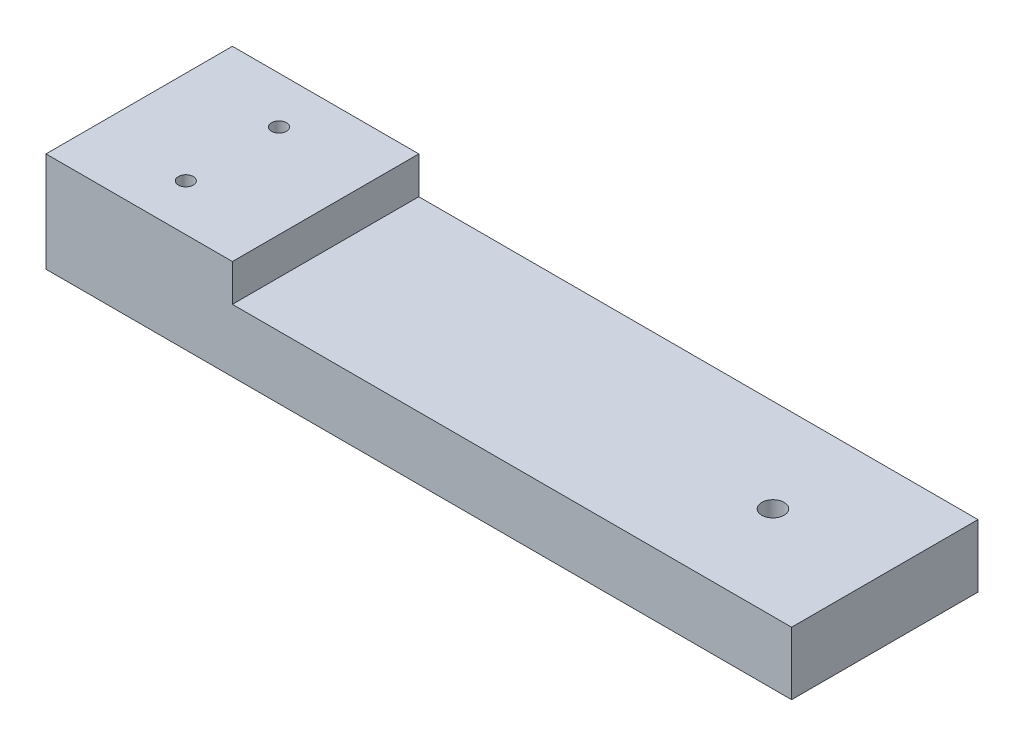
ISO-10303-21;
HEADER;
FILE_DESCRIPTION(('STEP AP214'),'2;1');
FILE_NAME('part.step','',(''),(''),'','','');
FILE_SCHEMA(('AUTOMOTIVE_DESIGN { 1 0 10303 214 1 1 1 1 }'));
ENDSEC;
DATA;
#1=APPLICATION_CONTEXT('core data for automotive mechanical design processes');
#2=APPLICATION_PROTOCOL_DEFINITION('international standard','automotive_design',2000,#1);
#3=PRODUCT_CONTEXT('',#1,'mechanical');
#4=PRODUCT('Part','Part','',(#3));
#5=PRODUCT_RELATED_PRODUCT_CATEGORY('part','',(#4));
#6=PRODUCT_DEFINITION_FORMATION('','',#4);
#7=PRODUCT_DEFINITION_CONTEXT('part definition',#1,'design');
#8=PRODUCT_DEFINITION('design','',#6,#7);
#9=PRODUCT_DEFINITION_SHAPE('','',#8);
#10=(LENGTH_UNIT() NAMED_UNIT(*) SI_UNIT(.MILLI.,.METRE.));
#11=(NAMED_UNIT(*) PLANE_ANGLE_UNIT() SI_UNIT($,.RADIAN.));
#12=(NAMED_UNIT(*) SI_UNIT($,.STERADIAN.) SOLID_ANGLE_UNIT());
#13=UNCERTAINTY_MEASURE_WITH_UNIT(LENGTH_MEASURE(1.E-05),#10,'distance_accuracy_value','');
#14=(GEOMETRIC_REPRESENTATION_CONTEXT(3) GLOBAL_UNCERTAINTY_ASSIGNED_CONTEXT((#13)) GLOBAL_UNIT_ASSIGNED_CONTEXT((#10,
#11,#12)) REPRESENTATION_CONTEXT('',''));
#15=CARTESIAN_POINT('',(0.,0.,0.));
#16=DIRECTION('',(0.,0.,1.));
#17=DIRECTION('',(1.,0.,0.));
#18=AXIS2_PLACEMENT_3D('',#15,#16,#17);
#19=CARTESIAN_POINT('',(0.,26.8,0.));
#20=DIRECTION('',(0.,0.,1.));
#21=DIRECTION('',(-1.,0.,0.));
#22=AXIS2_PLACEMENT_3D('',#19,#20,#21);
#23=PLANE('',#22);
#24=DIRECTION('',(1.,0.,0.));
#25=VECTOR('',#24,1.);
#26=CARTESIAN_POINT('',(0.,0.,0.));
#27=LINE('',#26,#25);
#28=CARTESIAN_POINT('',(0.,0.,0.));
#29=VERTEX_POINT('',#28);
#30=CARTESIAN_POINT('',(200.,0.,0.));
#31=VERTEX_POINT('',#30);
#32=EDGE_CURVE('E119',#29,#31,#27,.T.);
#33=ORIENTED_EDGE('',*,*,#32,.F.);
#34=DIRECTION('',(0.,-1.,0.));
#35=VECTOR('',#34,1.);
#36=CARTESIAN_POINT('',(0.,26.8,0.));
#37=LINE('',#36,#35);
#38=CARTESIAN_POINT('',(0.,26.8,0.));
#39=VERTEX_POINT('',#38);
#40=EDGE_CURVE('E132',#39,#29,#37,.T.);
#41=ORIENTED_EDGE('',*,*,#40,.F.);
#42=DIRECTION('',(1.,0.,0.));
#43=VECTOR('',#42,1.);
#44=CARTESIAN_POINT('',(0.,26.8,0.));
#45=LINE('',#44,#43);
#46=CARTESIAN_POINT('',(50.,26.8,0.));
#47=VERTEX_POINT('',#46);
#48=EDGE_CURVE('E126',#39,#47,#45,.T.);
#49=ORIENTED_EDGE('',*,*,#48,.T.);
#50=DIRECTION('',(0.,-1.,0.));
#51=VECTOR('',#50,1.);
#52=CARTESIAN_POINT('',(50.,26.8,0.));
#53=LINE('',#52,#51);
#54=CARTESIAN_POINT('',(50.,16.85,0.));
#55=VERTEX_POINT('',#54);
#56=EDGE_CURVE('E11',#47,#55,#53,.T.);
#57=ORIENTED_EDGE('',*,*,#56,.T.);
#58=DIRECTION('',(1.,0.,0.));
#59=VECTOR('',#58,1.);
#60=CARTESIAN_POINT('',(0.,16.85,0.));
#61=LINE('',#60,#59);
#62=CARTESIAN_POINT('',(200.,16.85,0.));
#63=VERTEX_POINT('',#62);
#64=EDGE_CURVE('E122',#55,#63,#61,.T.);
#65=ORIENTED_EDGE('',*,*,#64,.T.);
#66=DIRECTION('',(0.,-1.,0.));
#67=VECTOR('',#66,1.);
#68=CARTESIAN_POINT('',(200.,16.85,0.));
#69=LINE('',#68,#67);
#70=EDGE_CURVE('E106',#63,#31,#69,.T.);
#71=ORIENTED_EDGE('',*,*,#70,.T.);
#72=EDGE_LOOP('',(#33,#41,#49,#57,#65,#71));
#73=FACE_BOUND('',#72,.T.);
#74=ADVANCED_FACE('F37',(#73),#23,.F.);
#75=CARTESIAN_POINT('',(50.,26.8,0.));
#76=DIRECTION('',(-1.,0.,0.));
#77=DIRECTION('',(0.,0.,-1.));
#78=AXIS2_PLACEMENT_3D('',#75,#76,#77);
#79=PLANE('',#78);
#80=ORIENTED_EDGE('',*,*,#56,.F.);
#81=DIRECTION('',(0.,0.,1.));
#82=VECTOR('',#81,1.);
#83=CARTESIAN_POINT('',(50.,26.8,0.));
#84=LINE('',#83,#82);
#85=CARTESIAN_POINT('',(50.,26.8,50.));
#86=VERTEX_POINT('',#85);
#87=EDGE_CURVE('E82',#47,#86,#84,.T.);
#88=ORIENTED_EDGE('',*,*,#87,.T.);
#89=DIRECTION('',(0.,-1.,0.));
#90=VECTOR('',#89,1.);
#91=CARTESIAN_POINT('',(50.,26.8,50.));
#92=LINE('',#91,#90);
#93=CARTESIAN_POINT('',(50.,16.85,50.));
#94=VERTEX_POINT('',#93);
#95=EDGE_CURVE('E45',#86,#94,#92,.T.);
#96=ORIENTED_EDGE('',*,*,#95,.T.);
#97=DIRECTION('',(0.,0.,1.));
#98=VECTOR('',#97,1.);
#99=CARTESIAN_POINT('',(50.,16.85,0.));
#100=LINE('',#99,#98);
#101=EDGE_CURVE('E113',#55,#94,#100,.T.);
#102=ORIENTED_EDGE('',*,*,#101,.F.);
#103=EDGE_LOOP('',(#80,#88,#96,#102));
#104=FACE_BOUND('',#103,.T.);
#105=ADVANCED_FACE('F140',(#104),#79,.F.);
#106=CARTESIAN_POINT('',(0.,26.8,50.));
#107=DIRECTION('',(0.,0.,1.));
#108=DIRECTION('',(-1.,0.,0.));
#109=AXIS2_PLACEMENT_3D('',#106,#107,#108);
#110=PLANE('',#109);
#111=DIRECTION('',(1.,0.,0.));
#112=VECTOR('',#111,1.);
#113=CARTESIAN_POINT('',(0.,0.,50.));
#114=LINE('',#113,#112);
#115=CARTESIAN_POINT('',(0.,0.,50.));
#116=VERTEX_POINT('',#115);
#117=CARTESIAN_POINT('',(200.,0.,50.));
#118=VERTEX_POINT('',#117);
#119=EDGE_CURVE('E118',#116,#118,#114,.T.);
#120=ORIENTED_EDGE('',*,*,#119,.T.);
#121=DIRECTION('',(0.,-1.,0.));
#122=VECTOR('',#121,1.);
#123=CARTESIAN_POINT('',(200.,16.85,50.));
#124=LINE('',#123,#122);
#125=CARTESIAN_POINT('',(200.,16.85,50.));
#126=VERTEX_POINT('',#125);
#127=EDGE_CURVE('E103',#126,#118,#124,.T.);
#128=ORIENTED_EDGE('',*,*,#127,.F.);
#129=DIRECTION('',(1.,0.,0.));
#130=VECTOR('',#129,1.);
#131=CARTESIAN_POINT('',(0.,16.85,50.));
#132=LINE('',#131,#130);
#133=EDGE_CURVE('E52',#94,#126,#132,.T.);
#134=ORIENTED_EDGE('',*,*,#133,.F.);
#135=ORIENTED_EDGE('',*,*,#95,.F.);
#136=DIRECTION('',(1.,0.,0.));
#137=VECTOR('',#136,1.);
#138=CARTESIAN_POINT('',(0.,26.8,50.));
#139=LINE('',#138,#137);
#140=CARTESIAN_POINT('',(0.,26.8,50.));
#141=VERTEX_POINT('',#140);
#142=EDGE_CURVE('E130',#141,#86,#139,.T.);
#143=ORIENTED_EDGE('',*,*,#142,.F.);
#144=DIRECTION('',(0.,-1.,0.));
#145=VECTOR('',#144,1.);
#146=CARTESIAN_POINT('',(0.,26.8,50.));
#147=LINE('',#146,#145);
#148=EDGE_CURVE('E137',#141,#116,#147,.T.);
#149=ORIENTED_EDGE('',*,*,#148,.T.);
#150=EDGE_LOOP('',(#120,#128,#134,#135,#143,#149));
#151=FACE_BOUND('',#150,.T.);
#152=ADVANCED_FACE('F116',(#151),#110,.T.);
#153=CARTESIAN_POINT('',(0.,26.8,0.));
#154=DIRECTION('',(-1.,0.,0.));
#155=DIRECTION('',(0.,0.,-1.));
#156=AXIS2_PLACEMENT_3D('',#153,#154,#155);
#157=PLANE('',#156);
#158=DIRECTION('',(0.,0.,1.));
#159=VECTOR('',#158,1.);
#160=CARTESIAN_POINT('',(0.,0.,0.));
#161=LINE('',#160,#159);
#162=EDGE_CURVE('E76',#29,#116,#161,.T.);
#163=ORIENTED_EDGE('',*,*,#162,.T.);
#164=ORIENTED_EDGE('',*,*,#148,.F.);
#165=DIRECTION('',(0.,0.,1.));
#166=VECTOR('',#165,1.);
#167=CARTESIAN_POINT('',(0.,26.8,0.));
#168=LINE('',#167,#166);
#169=EDGE_CURVE('E61',#39,#141,#168,.T.);
#170=ORIENTED_EDGE('',*,*,#169,.F.);
#171=ORIENTED_EDGE('',*,*,#40,.T.);
#172=EDGE_LOOP('',(#163,#164,#170,#171));
#173=FACE_BOUND('',#172,.T.);
#174=ADVANCED_FACE('F144',(#173),#157,.T.);
#175=CARTESIAN_POINT('',(0.,26.8,0.));
#176=DIRECTION('',(0.,1.,0.));
#177=DIRECTION('',(0.,0.,-1.));
#178=AXIS2_PLACEMENT_3D('',#175,#176,#177);
#179=PLANE('',#178);
#180=CARTESIAN_POINT('',(25.,26.8,12.5));
#181=DIRECTION('',(0.,1.,0.));
#182=DIRECTION('',(0.,0.,1.));
#183=AXIS2_PLACEMENT_3D('',#180,#181,#182);
#184=CIRCLE('',#183,2.);
#185=CARTESIAN_POINT('',(25.,26.8,14.5));
#186=VERTEX_POINT('',#185);
#187=EDGE_CURVE('E149',#186,#186,#184,.T.);
#188=ORIENTED_EDGE('',*,*,#187,.F.);
#189=EDGE_LOOP('',(#188));
#190=FACE_BOUND('',#189,.T.);
#191=CARTESIAN_POINT('',(25.,26.8,37.5));
#192=DIRECTION('',(0.,1.,0.));
#193=DIRECTION('',(0.,0.,1.));
#194=AXIS2_PLACEMENT_3D('',#191,#192,#193);
#195=CIRCLE('',#194,2.);
#196=CARTESIAN_POINT('',(25.,26.8,39.5));
#197=VERTEX_POINT('',#196);
#198=EDGE_CURVE('E156',#197,#197,#195,.T.);
#199=ORIENTED_EDGE('',*,*,#198,.F.);
#200=EDGE_LOOP('',(#199));
#201=FACE_BOUND('',#200,.T.);
#202=ORIENTED_EDGE('',*,*,#48,.F.);
#203=ORIENTED_EDGE('',*,*,#169,.T.);
#204=ORIENTED_EDGE('',*,*,#142,.T.);
#205=ORIENTED_EDGE('',*,*,#87,.F.);
#206=EDGE_LOOP('',(#202,#203,#204,#205));
#207=FACE_BOUND('',#206,.T.);
#208=ADVANCED_FACE('F142',(#190,#201,#207),#179,.T.);
#209=CARTESIAN_POINT('',(0.,0.,0.));
#210=DIRECTION('',(0.,1.,0.));
#211=DIRECTION('',(0.,0.,-1.));
#212=AXIS2_PLACEMENT_3D('',#209,#210,#211);
#213=PLANE('',#212);
#214=CARTESIAN_POINT('',(25.,0.,12.5));
#215=DIRECTION('',(0.,1.,0.));
#216=DIRECTION('',(0.,0.,1.));
#217=AXIS2_PLACEMENT_3D('',#214,#215,#216);
#218=CIRCLE('',#217,2.);
#219=CARTESIAN_POINT('',(25.,0.,14.5));
#220=VERTEX_POINT('',#219);
#221=EDGE_CURVE('E162',#220,#220,#218,.T.);
#222=ORIENTED_EDGE('',*,*,#221,.T.);
#223=EDGE_LOOP('',(#222));
#224=FACE_BOUND('',#223,.T.);
#225=CARTESIAN_POINT('',(25.,0.,37.5));
#226=DIRECTION('',(0.,1.,0.));
#227=DIRECTION('',(0.,0.,1.));
#228=AXIS2_PLACEMENT_3D('',#225,#226,#227);
#229=CIRCLE('',#228,2.);
#230=CARTESIAN_POINT('',(25.,0.,39.5));
#231=VERTEX_POINT('',#230);
#232=EDGE_CURVE('E159',#231,#231,#229,.T.);
#233=ORIENTED_EDGE('',*,*,#232,.T.);
#234=EDGE_LOOP('',(#233));
#235=FACE_BOUND('',#234,.T.);
#236=CARTESIAN_POINT('',(170.,0.,25.));
#237=DIRECTION('',(0.,1.,0.));
#238=DIRECTION('',(0.,0.,1.));
#239=AXIS2_PLACEMENT_3D('',#236,#237,#238);
#240=CIRCLE('',#239,2.99999999999999);
#241=CARTESIAN_POINT('',(170.,0.,28.));
#242=VERTEX_POINT('',#241);
#243=EDGE_CURVE('E153',#242,#242,#240,.T.);
#244=ORIENTED_EDGE('',*,*,#243,.T.);
#245=EDGE_LOOP('',(#244));
#246=FACE_BOUND('',#245,.T.);
#247=ORIENTED_EDGE('',*,*,#32,.T.);
#248=DIRECTION('',(0.,0.,-1.));
#249=VECTOR('',#248,1.);
#250=CARTESIAN_POINT('',(200.,0.,0.));
#251=LINE('',#250,#249);
#252=EDGE_CURVE('E110',#118,#31,#251,.T.);
#253=ORIENTED_EDGE('',*,*,#252,.F.);
#254=ORIENTED_EDGE('',*,*,#119,.F.);
#255=ORIENTED_EDGE('',*,*,#162,.F.);
#256=EDGE_LOOP('',(#247,#253,#254,#255));
#257=FACE_BOUND('',#256,.T.);
#258=ADVANCED_FACE('F147',(#224,#235,#246,#257),#213,.F.);
#259=CARTESIAN_POINT('',(200.,16.85,0.));
#260=DIRECTION('',(1.,0.,0.));
#261=DIRECTION('',(0.,0.,1.));
#262=AXIS2_PLACEMENT_3D('',#259,#260,#261);
#263=PLANE('',#262);
#264=ORIENTED_EDGE('',*,*,#252,.T.);
#265=ORIENTED_EDGE('',*,*,#70,.F.);
#266=DIRECTION('',(0.,0.,-1.));
#267=VECTOR('',#266,1.);
#268=CARTESIAN_POINT('',(200.,16.85,0.));
#269=LINE('',#268,#267);
#270=EDGE_CURVE('E101',#126,#63,#269,.T.);
#271=ORIENTED_EDGE('',*,*,#270,.F.);
#272=ORIENTED_EDGE('',*,*,#127,.T.);
#273=EDGE_LOOP('',(#264,#265,#271,#272));
#274=FACE_BOUND('',#273,.T.);
#275=ADVANCED_FACE('F102',(#274),#263,.T.);
#276=CARTESIAN_POINT('',(0.,16.85,0.));
#277=DIRECTION('',(0.,1.,0.));
#278=DIRECTION('',(0.,0.,-1.));
#279=AXIS2_PLACEMENT_3D('',#276,#277,#278);
#280=PLANE('',#279);
#281=CARTESIAN_POINT('',(170.,16.85,25.));
#282=DIRECTION('',(0.,-1.,0.));
#283=DIRECTION('',(0.,0.,-1.));
#284=AXIS2_PLACEMENT_3D('',#281,#282,#283);
#285=CIRCLE('',#284,2.99999999999999);
#286=CARTESIAN_POINT('',(170.,16.85,22.));
#287=VERTEX_POINT('',#286);
#288=EDGE_CURVE('E40',#287,#287,#285,.T.);
#289=ORIENTED_EDGE('',*,*,#288,.T.);
#290=EDGE_LOOP('',(#289));
#291=FACE_BOUND('',#290,.T.);
#292=ORIENTED_EDGE('',*,*,#270,.T.);
#293=ORIENTED_EDGE('',*,*,#64,.F.);
#294=ORIENTED_EDGE('',*,*,#101,.T.);
#295=ORIENTED_EDGE('',*,*,#133,.T.);
#296=EDGE_LOOP('',(#292,#293,#294,#295));
#297=FACE_BOUND('',#296,.T.);
#298=ADVANCED_FACE('F112',(#291,#297),#280,.T.);
#299=CARTESIAN_POINT('',(170.,26.8,25.));
#300=DIRECTION('',(0.,-1.,0.));
#301=DIRECTION('',(0.,0.,1.));
#302=AXIS2_PLACEMENT_3D('',#299,#300,#301);
#303=CYLINDRICAL_SURFACE('',#302,2.99999999999999);
#304=ORIENTED_EDGE('',*,*,#288,.F.);
#305=EDGE_LOOP('',(#304));
#306=FACE_BOUND('',#305,.T.);
#307=ORIENTED_EDGE('',*,*,#243,.F.);
#308=EDGE_LOOP('',(#307));
#309=FACE_BOUND('',#308,.T.);
#310=ADVANCED_FACE('F179',(#306,#309),#303,.F.);
#311=CARTESIAN_POINT('',(25.,26.8,37.5));
#312=DIRECTION('',(0.,-1.,0.));
#313=DIRECTION('',(0.,0.,1.));
#314=AXIS2_PLACEMENT_3D('',#311,#312,#313);
#315=CYLINDRICAL_SURFACE('',#314,2.);
#316=ORIENTED_EDGE('',*,*,#198,.T.);
#317=EDGE_LOOP('',(#316));
#318=FACE_BOUND('',#317,.T.);
#319=ORIENTED_EDGE('',*,*,#232,.F.);
#320=EDGE_LOOP('',(#319));
#321=FACE_BOUND('',#320,.T.);
#322=ADVANCED_FACE('F176',(#318,#321),#315,.F.);
#323=CARTESIAN_POINT('',(25.,26.8,12.5));
#324=DIRECTION('',(0.,-1.,0.));
#325=DIRECTION('',(0.,0.,1.));
#326=AXIS2_PLACEMENT_3D('',#323,#324,#325);
#327=CYLINDRICAL_SURFACE('',#326,2.);
#328=ORIENTED_EDGE('',*,*,#187,.T.);
#329=EDGE_LOOP('',(#328));
#330=FACE_BOUND('',#329,.T.);
#331=ORIENTED_EDGE('',*,*,#221,.F.);
#332=EDGE_LOOP('',(#331));
#333=FACE_BOUND('',#332,.T.);
#334=ADVANCED_FACE('F168',(#330,#333),#327,.F.);
#335=CLOSED_SHELL('',(#74,#105,#152,#174,#208,#258,#275,#298,#310,#322,#334));
#336=MANIFOLD_SOLID_BREP('B2',#335);
#337=ADVANCED_BREP_SHAPE_REPRESENTATION('',(#18,#336),#14);
#338=SHAPE_DEFINITION_REPRESENTATION(#9,#337);
ENDSEC;
END-ISO-10303-21;
